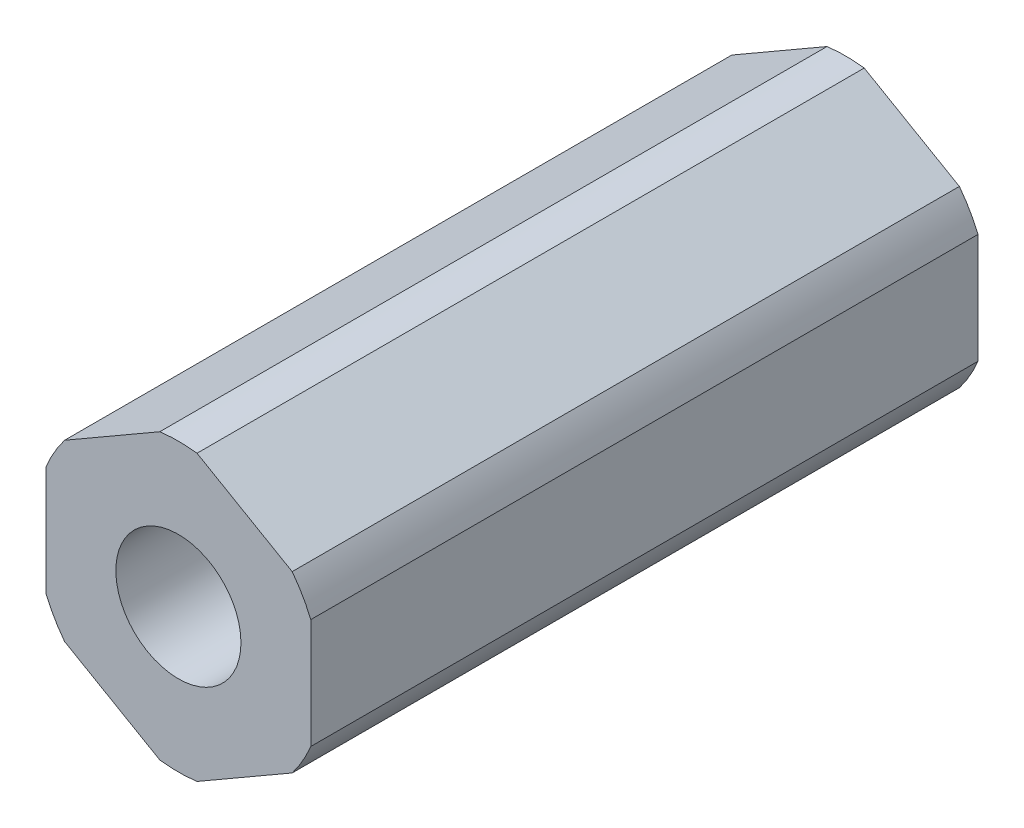
ISO-10303-21;
HEADER;
FILE_DESCRIPTION(('STEP AP214'),'2;1');
FILE_NAME('part.step','',(''),(''),'','','');
FILE_SCHEMA(('AUTOMOTIVE_DESIGN { 1 0 10303 214 1 1 1 1 }'));
ENDSEC;
DATA;
#1=APPLICATION_CONTEXT('core data for automotive mechanical design processes');
#2=APPLICATION_PROTOCOL_DEFINITION('international standard','automotive_design',2000,#1);
#3=PRODUCT_CONTEXT('',#1,'mechanical');
#4=PRODUCT('Part','Part','',(#3));
#5=PRODUCT_RELATED_PRODUCT_CATEGORY('part','',(#4));
#6=PRODUCT_DEFINITION_FORMATION('','',#4);
#7=PRODUCT_DEFINITION_CONTEXT('part definition',#1,'design');
#8=PRODUCT_DEFINITION('design','',#6,#7);
#9=PRODUCT_DEFINITION_SHAPE('','',#8);
#10=(LENGTH_UNIT() NAMED_UNIT(*) SI_UNIT(.MILLI.,.METRE.));
#11=(NAMED_UNIT(*) PLANE_ANGLE_UNIT() SI_UNIT($,.RADIAN.));
#12=(NAMED_UNIT(*) SI_UNIT($,.STERADIAN.) SOLID_ANGLE_UNIT());
#13=UNCERTAINTY_MEASURE_WITH_UNIT(LENGTH_MEASURE(1.E-05),#10,'distance_accuracy_value','');
#14=(GEOMETRIC_REPRESENTATION_CONTEXT(3) GLOBAL_UNCERTAINTY_ASSIGNED_CONTEXT((#13)) GLOBAL_UNIT_ASSIGNED_CONTEXT((#10,
#11,#12)) REPRESENTATION_CONTEXT('',''));
#15=CARTESIAN_POINT('',(0.,0.,0.));
#16=DIRECTION('',(0.,0.,1.));
#17=DIRECTION('',(1.,0.,0.));
#18=AXIS2_PLACEMENT_3D('',#15,#16,#17);
#19=CARTESIAN_POINT('',(0.,0.,16.));
#20=DIRECTION('',(0.,0.,1.));
#21=DIRECTION('',(1.,0.,0.));
#22=AXIS2_PLACEMENT_3D('',#19,#20,#21);
#23=PLANE('',#22);
#24=CARTESIAN_POINT('',(0.,0.,16.));
#25=DIRECTION('',(0.,0.,1.));
#26=DIRECTION('',(1.,0.,0.));
#27=AXIS2_PLACEMENT_3D('',#24,#25,#26);
#28=CIRCLE('',#27,6.875);
#29=CARTESIAN_POINT('',(6.34999999999997,2.63498102459967,16.));
#30=VERTEX_POINT('',#29);
#31=CARTESIAN_POINT('',(5.45696050579314,4.18177080173147,16.));
#32=VERTEX_POINT('',#31);
#33=EDGE_CURVE('E204',#30,#32,#28,.T.);
#34=ORIENTED_EDGE('',*,*,#33,.T.);
#35=DIRECTION('',(-0.866025403784441,0.499999999999995,0.));
#36=VECTOR('',#35,1.);
#37=CARTESIAN_POINT('',(5.45696050579314,4.18177080173147,16.));
#38=LINE('',#37,#36);
#39=CARTESIAN_POINT('',(0.89303949420682,6.81675182633099,16.));
#40=VERTEX_POINT('',#39);
#41=EDGE_CURVE('E116',#32,#40,#38,.T.);
#42=ORIENTED_EDGE('',*,*,#41,.T.);
#43=CARTESIAN_POINT('',(0.,0.,16.));
#44=DIRECTION('',(0.,0.,1.));
#45=DIRECTION('',(1.,0.,0.));
#46=AXIS2_PLACEMENT_3D('',#43,#44,#45);
#47=CIRCLE('',#46,6.875);
#48=CARTESIAN_POINT('',(-0.893039494206801,6.81675182633099,16.));
#49=VERTEX_POINT('',#48);
#50=EDGE_CURVE('E241',#40,#49,#47,.T.);
#51=ORIENTED_EDGE('',*,*,#50,.T.);
#52=DIRECTION('',(-0.866025403784438,-0.500000000000001,0.));
#53=VECTOR('',#52,1.);
#54=CARTESIAN_POINT('',(-0.893039494206801,6.81675182633099,16.));
#55=LINE('',#54,#53);
#56=CARTESIAN_POINT('',(-5.45696050579321,4.18177080173138,16.));
#57=VERTEX_POINT('',#56);
#58=EDGE_CURVE('E261',#49,#57,#55,.T.);
#59=ORIENTED_EDGE('',*,*,#58,.T.);
#60=CARTESIAN_POINT('',(0.,0.,16.));
#61=DIRECTION('',(0.,0.,1.));
#62=DIRECTION('',(1.,0.,0.));
#63=AXIS2_PLACEMENT_3D('',#60,#61,#62);
#64=CIRCLE('',#63,6.875);
#65=CARTESIAN_POINT('',(-6.35000000000001,2.63498102459958,16.));
#66=VERTEX_POINT('',#65);
#67=EDGE_CURVE('E257',#57,#66,#64,.T.);
#68=ORIENTED_EDGE('',*,*,#67,.T.);
#69=DIRECTION('',(0.,-1.,0.));
#70=VECTOR('',#69,1.);
#71=CARTESIAN_POINT('',(-6.35000000000001,2.63498102459958,16.));
#72=LINE('',#71,#70);
#73=CARTESIAN_POINT('',(-6.34999999999999,-2.63498102459963,16.));
#74=VERTEX_POINT('',#73);
#75=EDGE_CURVE('E260',#66,#74,#72,.T.);
#76=ORIENTED_EDGE('',*,*,#75,.T.);
#77=CARTESIAN_POINT('',(0.,0.,16.));
#78=DIRECTION('',(0.,0.,1.));
#79=DIRECTION('',(1.,0.,0.));
#80=AXIS2_PLACEMENT_3D('',#77,#78,#79);
#81=CIRCLE('',#80,6.875);
#82=CARTESIAN_POINT('',(-5.45696050579318,-4.18177080173141,16.));
#83=VERTEX_POINT('',#82);
#84=EDGE_CURVE('E265',#74,#83,#81,.T.);
#85=ORIENTED_EDGE('',*,*,#84,.T.);
#86=DIRECTION('',(0.866025403784442,-0.499999999999995,0.));
#87=VECTOR('',#86,1.);
#88=CARTESIAN_POINT('',(-5.45696050579318,-4.18177080173142,16.));
#89=LINE('',#88,#87);
#90=CARTESIAN_POINT('',(-0.893039494206756,-6.81675182633099,16.));
#91=VERTEX_POINT('',#90);
#92=EDGE_CURVE('E272',#83,#91,#89,.T.);
#93=ORIENTED_EDGE('',*,*,#92,.T.);
#94=CARTESIAN_POINT('',(0.,0.,16.));
#95=DIRECTION('',(0.,0.,1.));
#96=DIRECTION('',(1.,0.,0.));
#97=AXIS2_PLACEMENT_3D('',#94,#95,#96);
#98=CIRCLE('',#97,6.875);
#99=CARTESIAN_POINT('',(0.893039494206851,-6.81675182633098,16.));
#100=VERTEX_POINT('',#99);
#101=EDGE_CURVE('E147',#91,#100,#98,.T.);
#102=ORIENTED_EDGE('',*,*,#101,.T.);
#103=DIRECTION('',(0.866025403784435,0.500000000000007,0.));
#104=VECTOR('',#103,1.);
#105=CARTESIAN_POINT('',(0.893039494206852,-6.81675182633098,16.));
#106=LINE('',#105,#104);
#107=CARTESIAN_POINT('',(5.45696050579324,-4.18177080173134,16.));
#108=VERTEX_POINT('',#107);
#109=EDGE_CURVE('E141',#100,#108,#106,.T.);
#110=ORIENTED_EDGE('',*,*,#109,.T.);
#111=CARTESIAN_POINT('',(0.,0.,16.));
#112=DIRECTION('',(0.,0.,1.));
#113=DIRECTION('',(1.,0.,0.));
#114=AXIS2_PLACEMENT_3D('',#111,#112,#113);
#115=CIRCLE('',#114,6.875);
#116=CARTESIAN_POINT('',(6.35000000000003,-2.63498102459954,16.));
#117=VERTEX_POINT('',#116);
#118=EDGE_CURVE('E145',#108,#117,#115,.T.);
#119=ORIENTED_EDGE('',*,*,#118,.T.);
#120=DIRECTION('',(0.,1.,0.));
#121=VECTOR('',#120,1.);
#122=CARTESIAN_POINT('',(6.35000000000003,-2.63498102459954,16.));
#123=LINE('',#122,#121);
#124=EDGE_CURVE('E61',#117,#30,#123,.T.);
#125=ORIENTED_EDGE('',*,*,#124,.T.);
#126=EDGE_LOOP('',(#34,#42,#51,#59,#68,#76,#85,#93,#102,#110,#119,#125));
#127=FACE_BOUND('',#126,.T.);
#128=CARTESIAN_POINT('',(0.,0.,16.));
#129=DIRECTION('',(0.,0.,1.));
#130=DIRECTION('',(1.,0.,0.));
#131=AXIS2_PLACEMENT_3D('',#128,#129,#130);
#132=CIRCLE('',#131,3.);
#133=CARTESIAN_POINT('',(3.,0.,16.));
#134=VERTEX_POINT('',#133);
#135=EDGE_CURVE('E174',#134,#134,#132,.T.);
#136=ORIENTED_EDGE('',*,*,#135,.F.);
#137=EDGE_LOOP('',(#136));
#138=FACE_BOUND('',#137,.T.);
#139=ADVANCED_FACE('F43',(#127,#138),#23,.T.);
#140=CARTESIAN_POINT('',(0.,0.,-16.));
#141=DIRECTION('',(0.,0.,1.));
#142=DIRECTION('',(1.,0.,0.));
#143=AXIS2_PLACEMENT_3D('',#140,#141,#142);
#144=PLANE('',#143);
#145=CARTESIAN_POINT('',(0.,0.,-16.));
#146=DIRECTION('',(0.,0.,1.));
#147=DIRECTION('',(1.,0.,0.));
#148=AXIS2_PLACEMENT_3D('',#145,#146,#147);
#149=CIRCLE('',#148,6.875);
#150=CARTESIAN_POINT('',(6.34999999999997,2.63498102459967,-16.));
#151=VERTEX_POINT('',#150);
#152=CARTESIAN_POINT('',(5.45696050579314,4.18177080173147,-16.));
#153=VERTEX_POINT('',#152);
#154=EDGE_CURVE('E169',#151,#153,#149,.T.);
#155=ORIENTED_EDGE('',*,*,#154,.F.);
#156=DIRECTION('',(0.,1.,0.));
#157=VECTOR('',#156,1.);
#158=CARTESIAN_POINT('',(6.35000000000003,-2.63498102459954,-16.));
#159=LINE('',#158,#157);
#160=CARTESIAN_POINT('',(6.35000000000003,-2.63498102459954,-16.));
#161=VERTEX_POINT('',#160);
#162=EDGE_CURVE('E108',#161,#151,#159,.T.);
#163=ORIENTED_EDGE('',*,*,#162,.F.);
#164=CARTESIAN_POINT('',(0.,0.,-16.));
#165=DIRECTION('',(0.,0.,1.));
#166=DIRECTION('',(1.,0.,0.));
#167=AXIS2_PLACEMENT_3D('',#164,#165,#166);
#168=CIRCLE('',#167,6.875);
#169=CARTESIAN_POINT('',(5.45696050579324,-4.18177080173134,-16.));
#170=VERTEX_POINT('',#169);
#171=EDGE_CURVE('E102',#170,#161,#168,.T.);
#172=ORIENTED_EDGE('',*,*,#171,.F.);
#173=DIRECTION('',(0.866025403784435,0.500000000000007,0.));
#174=VECTOR('',#173,1.);
#175=CARTESIAN_POINT('',(0.893039494206852,-6.81675182633098,-16.));
#176=LINE('',#175,#174);
#177=CARTESIAN_POINT('',(0.893039494206851,-6.81675182633098,-16.));
#178=VERTEX_POINT('',#177);
#179=EDGE_CURVE('E156',#178,#170,#176,.T.);
#180=ORIENTED_EDGE('',*,*,#179,.F.);
#181=CARTESIAN_POINT('',(0.,0.,-16.));
#182=DIRECTION('',(0.,0.,1.));
#183=DIRECTION('',(1.,0.,0.));
#184=AXIS2_PLACEMENT_3D('',#181,#182,#183);
#185=CIRCLE('',#184,6.875);
#186=CARTESIAN_POINT('',(-0.893039494206756,-6.81675182633099,-16.));
#187=VERTEX_POINT('',#186);
#188=EDGE_CURVE('E195',#187,#178,#185,.T.);
#189=ORIENTED_EDGE('',*,*,#188,.F.);
#190=DIRECTION('',(0.866025403784442,-0.499999999999995,0.));
#191=VECTOR('',#190,1.);
#192=CARTESIAN_POINT('',(-5.45696050579318,-4.18177080173142,-16.));
#193=LINE('',#192,#191);
#194=CARTESIAN_POINT('',(-5.45696050579318,-4.18177080173141,-16.));
#195=VERTEX_POINT('',#194);
#196=EDGE_CURVE('E192',#195,#187,#193,.T.);
#197=ORIENTED_EDGE('',*,*,#196,.F.);
#198=CARTESIAN_POINT('',(0.,0.,-16.));
#199=DIRECTION('',(0.,0.,1.));
#200=DIRECTION('',(1.,0.,0.));
#201=AXIS2_PLACEMENT_3D('',#198,#199,#200);
#202=CIRCLE('',#201,6.875);
#203=CARTESIAN_POINT('',(-6.34999999999999,-2.63498102459963,-16.));
#204=VERTEX_POINT('',#203);
#205=EDGE_CURVE('E189',#204,#195,#202,.T.);
#206=ORIENTED_EDGE('',*,*,#205,.F.);
#207=DIRECTION('',(0.,-1.,0.));
#208=VECTOR('',#207,1.);
#209=CARTESIAN_POINT('',(-6.35000000000001,2.63498102459958,-16.));
#210=LINE('',#209,#208);
#211=CARTESIAN_POINT('',(-6.35000000000001,2.63498102459958,-16.));
#212=VERTEX_POINT('',#211);
#213=EDGE_CURVE('E186',#212,#204,#210,.T.);
#214=ORIENTED_EDGE('',*,*,#213,.F.);
#215=CARTESIAN_POINT('',(0.,0.,-16.));
#216=DIRECTION('',(0.,0.,1.));
#217=DIRECTION('',(1.,0.,0.));
#218=AXIS2_PLACEMENT_3D('',#215,#216,#217);
#219=CIRCLE('',#218,6.875);
#220=CARTESIAN_POINT('',(-5.45696050579321,4.18177080173138,-16.));
#221=VERTEX_POINT('',#220);
#222=EDGE_CURVE('E183',#221,#212,#219,.T.);
#223=ORIENTED_EDGE('',*,*,#222,.F.);
#224=DIRECTION('',(-0.866025403784438,-0.500000000000001,0.));
#225=VECTOR('',#224,1.);
#226=CARTESIAN_POINT('',(-0.893039494206801,6.81675182633099,-16.));
#227=LINE('',#226,#225);
#228=CARTESIAN_POINT('',(-0.893039494206801,6.81675182633099,-16.));
#229=VERTEX_POINT('',#228);
#230=EDGE_CURVE('E180',#229,#221,#227,.T.);
#231=ORIENTED_EDGE('',*,*,#230,.F.);
#232=CARTESIAN_POINT('',(0.,0.,-16.));
#233=DIRECTION('',(0.,0.,1.));
#234=DIRECTION('',(1.,0.,0.));
#235=AXIS2_PLACEMENT_3D('',#232,#233,#234);
#236=CIRCLE('',#235,6.875);
#237=CARTESIAN_POINT('',(0.89303949420682,6.81675182633099,-16.));
#238=VERTEX_POINT('',#237);
#239=EDGE_CURVE('E177',#238,#229,#236,.T.);
#240=ORIENTED_EDGE('',*,*,#239,.F.);
#241=DIRECTION('',(-0.866025403784441,0.499999999999995,0.));
#242=VECTOR('',#241,1.);
#243=CARTESIAN_POINT('',(5.45696050579314,4.18177080173147,-16.));
#244=LINE('',#243,#242);
#245=EDGE_CURVE('E173',#153,#238,#244,.T.);
#246=ORIENTED_EDGE('',*,*,#245,.F.);
#247=EDGE_LOOP('',(#155,#163,#172,#180,#189,#197,#206,#214,#223,#231,#240,#246));
#248=FACE_BOUND('',#247,.T.);
#249=CARTESIAN_POINT('',(0.,0.,-16.));
#250=DIRECTION('',(0.,0.,1.));
#251=DIRECTION('',(1.,0.,0.));
#252=AXIS2_PLACEMENT_3D('',#249,#250,#251);
#253=CIRCLE('',#252,3.);
#254=CARTESIAN_POINT('',(3.,0.,-16.));
#255=VERTEX_POINT('',#254);
#256=EDGE_CURVE('E451',#255,#255,#253,.T.);
#257=ORIENTED_EDGE('',*,*,#256,.T.);
#258=EDGE_LOOP('',(#257));
#259=FACE_BOUND('',#258,.T.);
#260=ADVANCED_FACE('F245',(#248,#259),#144,.F.);
#261=CARTESIAN_POINT('',(0.,0.,16.));
#262=DIRECTION('',(0.,0.,-1.));
#263=DIRECTION('',(-1.,0.,0.));
#264=AXIS2_PLACEMENT_3D('',#261,#262,#263);
#265=CYLINDRICAL_SURFACE('',#264,6.875);
#266=ORIENTED_EDGE('',*,*,#154,.T.);
#267=DIRECTION('',(0.,0.,-1.));
#268=VECTOR('',#267,1.);
#269=CARTESIAN_POINT('',(5.45696050579314,4.18177080173147,16.));
#270=LINE('',#269,#268);
#271=EDGE_CURVE('E11',#32,#153,#270,.T.);
#272=ORIENTED_EDGE('',*,*,#271,.F.);
#273=ORIENTED_EDGE('',*,*,#33,.F.);
#274=DIRECTION('',(0.,0.,-1.));
#275=VECTOR('',#274,1.);
#276=CARTESIAN_POINT('',(6.34999999999997,2.63498102459967,16.));
#277=LINE('',#276,#275);
#278=EDGE_CURVE('E165',#30,#151,#277,.T.);
#279=ORIENTED_EDGE('',*,*,#278,.T.);
#280=EDGE_LOOP('',(#266,#272,#273,#279));
#281=FACE_BOUND('',#280,.T.);
#282=ADVANCED_FACE('F45',(#281),#265,.T.);
#283=CARTESIAN_POINT('',(5.45696050579314,4.18177080173147,16.));
#284=DIRECTION('',(-0.499999999999995,-0.866025403784441,0.));
#285=DIRECTION('',(0.866025403784441,-0.499999999999995,0.));
#286=AXIS2_PLACEMENT_3D('',#283,#284,#285);
#287=PLANE('',#286);
#288=ORIENTED_EDGE('',*,*,#245,.T.);
#289=DIRECTION('',(0.,0.,-1.));
#290=VECTOR('',#289,1.);
#291=CARTESIAN_POINT('',(0.89303949420682,6.81675182633099,16.));
#292=LINE('',#291,#290);
#293=EDGE_CURVE('E53',#40,#238,#292,.T.);
#294=ORIENTED_EDGE('',*,*,#293,.F.);
#295=ORIENTED_EDGE('',*,*,#41,.F.);
#296=ORIENTED_EDGE('',*,*,#271,.T.);
#297=EDGE_LOOP('',(#288,#294,#295,#296));
#298=FACE_BOUND('',#297,.T.);
#299=ADVANCED_FACE('F308',(#298),#287,.F.);
#300=CARTESIAN_POINT('',(0.,0.,16.));
#301=DIRECTION('',(0.,0.,-1.));
#302=DIRECTION('',(-1.,0.,0.));
#303=AXIS2_PLACEMENT_3D('',#300,#301,#302);
#304=CYLINDRICAL_SURFACE('',#303,6.875);
#305=ORIENTED_EDGE('',*,*,#239,.T.);
#306=DIRECTION('',(0.,0.,-1.));
#307=VECTOR('',#306,1.);
#308=CARTESIAN_POINT('',(-0.893039494206801,6.81675182633099,16.));
#309=LINE('',#308,#307);
#310=EDGE_CURVE('E231',#49,#229,#309,.T.);
#311=ORIENTED_EDGE('',*,*,#310,.F.);
#312=ORIENTED_EDGE('',*,*,#50,.F.);
#313=ORIENTED_EDGE('',*,*,#293,.T.);
#314=EDGE_LOOP('',(#305,#311,#312,#313));
#315=FACE_BOUND('',#314,.T.);
#316=ADVANCED_FACE('F239',(#315),#304,.T.);
#317=CARTESIAN_POINT('',(-0.893039494206801,6.81675182633099,16.));
#318=DIRECTION('',(0.500000000000001,-0.866025403784438,0.));
#319=DIRECTION('',(0.866025403784438,0.500000000000001,0.));
#320=AXIS2_PLACEMENT_3D('',#317,#318,#319);
#321=PLANE('',#320);
#322=ORIENTED_EDGE('',*,*,#230,.T.);
#323=DIRECTION('',(0.,0.,-1.));
#324=VECTOR('',#323,1.);
#325=CARTESIAN_POINT('',(-5.45696050579321,4.18177080173138,16.));
#326=LINE('',#325,#324);
#327=EDGE_CURVE('E227',#57,#221,#326,.T.);
#328=ORIENTED_EDGE('',*,*,#327,.F.);
#329=ORIENTED_EDGE('',*,*,#58,.F.);
#330=ORIENTED_EDGE('',*,*,#310,.T.);
#331=EDGE_LOOP('',(#322,#328,#329,#330));
#332=FACE_BOUND('',#331,.T.);
#333=ADVANCED_FACE('F251',(#332),#321,.F.);
#334=CARTESIAN_POINT('',(0.,0.,16.));
#335=DIRECTION('',(0.,0.,-1.));
#336=DIRECTION('',(-1.,0.,0.));
#337=AXIS2_PLACEMENT_3D('',#334,#335,#336);
#338=CYLINDRICAL_SURFACE('',#337,6.875);
#339=ORIENTED_EDGE('',*,*,#222,.T.);
#340=DIRECTION('',(0.,0.,-1.));
#341=VECTOR('',#340,1.);
#342=CARTESIAN_POINT('',(-6.35000000000001,2.63498102459958,16.));
#343=LINE('',#342,#341);
#344=EDGE_CURVE('E223',#66,#212,#343,.T.);
#345=ORIENTED_EDGE('',*,*,#344,.F.);
#346=ORIENTED_EDGE('',*,*,#67,.F.);
#347=ORIENTED_EDGE('',*,*,#327,.T.);
#348=EDGE_LOOP('',(#339,#345,#346,#347));
#349=FACE_BOUND('',#348,.T.);
#350=ADVANCED_FACE('F255',(#349),#338,.T.);
#351=CARTESIAN_POINT('',(-6.35000000000001,2.63498102459958,16.));
#352=DIRECTION('',(1.,0.,0.));
#353=DIRECTION('',(0.,1.,0.));
#354=AXIS2_PLACEMENT_3D('',#351,#352,#353);
#355=PLANE('',#354);
#356=ORIENTED_EDGE('',*,*,#213,.T.);
#357=DIRECTION('',(0.,0.,-1.));
#358=VECTOR('',#357,1.);
#359=CARTESIAN_POINT('',(-6.34999999999999,-2.63498102459963,16.));
#360=LINE('',#359,#358);
#361=EDGE_CURVE('E219',#74,#204,#360,.T.);
#362=ORIENTED_EDGE('',*,*,#361,.F.);
#363=ORIENTED_EDGE('',*,*,#75,.F.);
#364=ORIENTED_EDGE('',*,*,#344,.T.);
#365=EDGE_LOOP('',(#356,#362,#363,#364));
#366=FACE_BOUND('',#365,.T.);
#367=ADVANCED_FACE('F321',(#366),#355,.F.);
#368=CARTESIAN_POINT('',(0.,0.,16.));
#369=DIRECTION('',(0.,0.,-1.));
#370=DIRECTION('',(-1.,0.,0.));
#371=AXIS2_PLACEMENT_3D('',#368,#369,#370);
#372=CYLINDRICAL_SURFACE('',#371,6.875);
#373=ORIENTED_EDGE('',*,*,#205,.T.);
#374=DIRECTION('',(0.,0.,-1.));
#375=VECTOR('',#374,1.);
#376=CARTESIAN_POINT('',(-5.45696050579318,-4.18177080173141,16.));
#377=LINE('',#376,#375);
#378=EDGE_CURVE('E215',#83,#195,#377,.T.);
#379=ORIENTED_EDGE('',*,*,#378,.F.);
#380=ORIENTED_EDGE('',*,*,#84,.F.);
#381=ORIENTED_EDGE('',*,*,#361,.T.);
#382=EDGE_LOOP('',(#373,#379,#380,#381));
#383=FACE_BOUND('',#382,.T.);
#384=ADVANCED_FACE('F324',(#383),#372,.T.);
#385=CARTESIAN_POINT('',(-5.45696050579318,-4.18177080173142,16.));
#386=DIRECTION('',(0.499999999999995,0.866025403784442,0.));
#387=DIRECTION('',(-0.866025403784442,0.499999999999995,0.));
#388=AXIS2_PLACEMENT_3D('',#385,#386,#387);
#389=PLANE('',#388);
#390=ORIENTED_EDGE('',*,*,#196,.T.);
#391=DIRECTION('',(0.,0.,-1.));
#392=VECTOR('',#391,1.);
#393=CARTESIAN_POINT('',(-0.893039494206756,-6.81675182633099,16.));
#394=LINE('',#393,#392);
#395=EDGE_CURVE('E211',#91,#187,#394,.T.);
#396=ORIENTED_EDGE('',*,*,#395,.F.);
#397=ORIENTED_EDGE('',*,*,#92,.F.);
#398=ORIENTED_EDGE('',*,*,#378,.T.);
#399=EDGE_LOOP('',(#390,#396,#397,#398));
#400=FACE_BOUND('',#399,.T.);
#401=ADVANCED_FACE('F280',(#400),#389,.F.);
#402=CARTESIAN_POINT('',(0.,0.,16.));
#403=DIRECTION('',(0.,0.,-1.));
#404=DIRECTION('',(-1.,0.,0.));
#405=AXIS2_PLACEMENT_3D('',#402,#403,#404);
#406=CYLINDRICAL_SURFACE('',#405,6.875);
#407=ORIENTED_EDGE('',*,*,#188,.T.);
#408=DIRECTION('',(0.,0.,-1.));
#409=VECTOR('',#408,1.);
#410=CARTESIAN_POINT('',(0.893039494206851,-6.81675182633098,16.));
#411=LINE('',#410,#409);
#412=EDGE_CURVE('E158',#100,#178,#411,.T.);
#413=ORIENTED_EDGE('',*,*,#412,.F.);
#414=ORIENTED_EDGE('',*,*,#101,.F.);
#415=ORIENTED_EDGE('',*,*,#395,.T.);
#416=EDGE_LOOP('',(#407,#413,#414,#415));
#417=FACE_BOUND('',#416,.T.);
#418=ADVANCED_FACE('F284',(#417),#406,.T.);
#419=CARTESIAN_POINT('',(0.893039494206852,-6.81675182633098,16.));
#420=DIRECTION('',(-0.500000000000007,0.866025403784435,0.));
#421=DIRECTION('',(-0.866025403784435,-0.500000000000007,0.));
#422=AXIS2_PLACEMENT_3D('',#419,#420,#421);
#423=PLANE('',#422);
#424=ORIENTED_EDGE('',*,*,#179,.T.);
#425=DIRECTION('',(0.,0.,-1.));
#426=VECTOR('',#425,1.);
#427=CARTESIAN_POINT('',(5.45696050579324,-4.18177080173134,16.));
#428=LINE('',#427,#426);
#429=EDGE_CURVE('E153',#108,#170,#428,.T.);
#430=ORIENTED_EDGE('',*,*,#429,.F.);
#431=ORIENTED_EDGE('',*,*,#109,.F.);
#432=ORIENTED_EDGE('',*,*,#412,.T.);
#433=EDGE_LOOP('',(#424,#430,#431,#432));
#434=FACE_BOUND('',#433,.T.);
#435=ADVANCED_FACE('F154',(#434),#423,.F.);
#436=CARTESIAN_POINT('',(0.,0.,16.));
#437=DIRECTION('',(0.,0.,-1.));
#438=DIRECTION('',(-1.,0.,0.));
#439=AXIS2_PLACEMENT_3D('',#436,#437,#438);
#440=CYLINDRICAL_SURFACE('',#439,6.875);
#441=ORIENTED_EDGE('',*,*,#171,.T.);
#442=DIRECTION('',(0.,0.,-1.));
#443=VECTOR('',#442,1.);
#444=CARTESIAN_POINT('',(6.35000000000003,-2.63498102459954,16.));
#445=LINE('',#444,#443);
#446=EDGE_CURVE('E159',#117,#161,#445,.T.);
#447=ORIENTED_EDGE('',*,*,#446,.F.);
#448=ORIENTED_EDGE('',*,*,#118,.F.);
#449=ORIENTED_EDGE('',*,*,#429,.T.);
#450=EDGE_LOOP('',(#441,#447,#448,#449));
#451=FACE_BOUND('',#450,.T.);
#452=ADVANCED_FACE('F161',(#451),#440,.T.);
#453=CARTESIAN_POINT('',(6.35000000000003,-2.63498102459954,16.));
#454=DIRECTION('',(-1.,0.,0.));
#455=DIRECTION('',(0.,-1.,0.));
#456=AXIS2_PLACEMENT_3D('',#453,#454,#455);
#457=PLANE('',#456);
#458=ORIENTED_EDGE('',*,*,#162,.T.);
#459=ORIENTED_EDGE('',*,*,#278,.F.);
#460=ORIENTED_EDGE('',*,*,#124,.F.);
#461=ORIENTED_EDGE('',*,*,#446,.T.);
#462=EDGE_LOOP('',(#458,#459,#460,#461));
#463=FACE_BOUND('',#462,.T.);
#464=ADVANCED_FACE('F288',(#463),#457,.F.);
#465=CARTESIAN_POINT('',(0.,0.,16.));
#466=DIRECTION('',(0.,0.,-1.));
#467=DIRECTION('',(-1.,0.,0.));
#468=AXIS2_PLACEMENT_3D('',#465,#466,#467);
#469=CYLINDRICAL_SURFACE('',#468,3.);
#470=ORIENTED_EDGE('',*,*,#135,.T.);
#471=EDGE_LOOP('',(#470));
#472=FACE_BOUND('',#471,.T.);
#473=ORIENTED_EDGE('',*,*,#256,.F.);
#474=EDGE_LOOP('',(#473));
#475=FACE_BOUND('',#474,.T.);
#476=ADVANCED_FACE('F290',(#472,#475),#469,.F.);
#477=CLOSED_SHELL('',(#139,#260,#282,#299,#316,#333,#350,#367,#384,#401,#418,#435,#452,#464,#476));
#478=MANIFOLD_SOLID_BREP('B2',#477);
#479=ADVANCED_BREP_SHAPE_REPRESENTATION('',(#18,#478),#14);
#480=SHAPE_DEFINITION_REPRESENTATION(#9,#479);
ENDSEC;
END-ISO-10303-21;
